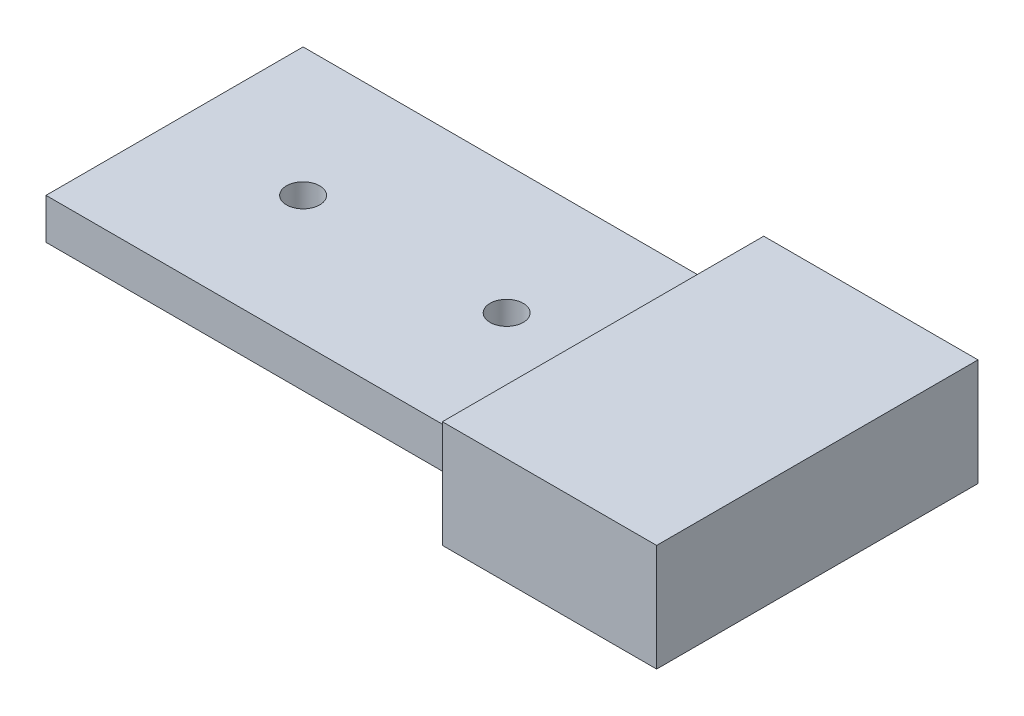
ISO-10303-21;
HEADER;
FILE_DESCRIPTION(('STEP AP214'),'2;1');
FILE_NAME('part.step','',(''),(''),'','','');
FILE_SCHEMA(('AUTOMOTIVE_DESIGN { 1 0 10303 214 1 1 1 1 }'));
ENDSEC;
DATA;
#1=APPLICATION_CONTEXT('core data for automotive mechanical design processes');
#2=APPLICATION_PROTOCOL_DEFINITION('international standard','automotive_design',2000,#1);
#3=PRODUCT_CONTEXT('',#1,'mechanical');
#4=PRODUCT('Part','Part','',(#3));
#5=PRODUCT_RELATED_PRODUCT_CATEGORY('part','',(#4));
#6=PRODUCT_DEFINITION_FORMATION('','',#4);
#7=PRODUCT_DEFINITION_CONTEXT('part definition',#1,'design');
#8=PRODUCT_DEFINITION('design','',#6,#7);
#9=PRODUCT_DEFINITION_SHAPE('','',#8);
#10=(LENGTH_UNIT() NAMED_UNIT(*) SI_UNIT(.MILLI.,.METRE.));
#11=(NAMED_UNIT(*) PLANE_ANGLE_UNIT() SI_UNIT($,.RADIAN.));
#12=(NAMED_UNIT(*) SI_UNIT($,.STERADIAN.) SOLID_ANGLE_UNIT());
#13=UNCERTAINTY_MEASURE_WITH_UNIT(LENGTH_MEASURE(1.E-05),#10,'distance_accuracy_value','');
#14=(GEOMETRIC_REPRESENTATION_CONTEXT(3) GLOBAL_UNCERTAINTY_ASSIGNED_CONTEXT((#13)) GLOBAL_UNIT_ASSIGNED_CONTEXT((#10,
#11,#12)) REPRESENTATION_CONTEXT('',''));
#15=CARTESIAN_POINT('',(0.,0.,0.));
#16=DIRECTION('',(0.,0.,1.));
#17=DIRECTION('',(1.,0.,0.));
#18=AXIS2_PLACEMENT_3D('',#15,#16,#17);
#19=CARTESIAN_POINT('',(40.,-1.9,12.));
#20=DIRECTION('',(0.,0.,-1.));
#21=DIRECTION('',(-1.,0.,0.));
#22=AXIS2_PLACEMENT_3D('',#19,#20,#21);
#23=PLANE('',#22);
#24=DIRECTION('',(0.,-1.,0.));
#25=VECTOR('',#24,1.);
#26=CARTESIAN_POINT('',(0.,-1.9,12.));
#27=LINE('',#26,#25);
#28=CARTESIAN_POINT('',(0.,1.9,12.));
#29=VERTEX_POINT('',#28);
#30=CARTESIAN_POINT('',(0.,-1.9,12.));
#31=VERTEX_POINT('',#30);
#32=EDGE_CURVE('E146',#29,#31,#27,.T.);
#33=ORIENTED_EDGE('',*,*,#32,.T.);
#34=DIRECTION('',(-1.,0.,0.));
#35=VECTOR('',#34,1.);
#36=CARTESIAN_POINT('',(40.,-1.9,12.));
#37=LINE('',#36,#35);
#38=CARTESIAN_POINT('',(40.,-1.9,12.));
#39=VERTEX_POINT('',#38);
#40=EDGE_CURVE('E11',#39,#31,#37,.T.);
#41=ORIENTED_EDGE('',*,*,#40,.F.);
#42=DIRECTION('',(0.,-1.,0.));
#43=VECTOR('',#42,1.);
#44=CARTESIAN_POINT('',(40.,-1.9,12.));
#45=LINE('',#44,#43);
#46=CARTESIAN_POINT('',(40.,1.9,12.));
#47=VERTEX_POINT('',#46);
#48=EDGE_CURVE('E152',#47,#39,#45,.T.);
#49=ORIENTED_EDGE('',*,*,#48,.F.);
#50=DIRECTION('',(-1.,0.,0.));
#51=VECTOR('',#50,1.);
#52=CARTESIAN_POINT('',(40.,1.9,12.));
#53=LINE('',#52,#51);
#54=EDGE_CURVE('E162',#47,#29,#53,.T.);
#55=ORIENTED_EDGE('',*,*,#54,.T.);
#56=EDGE_LOOP('',(#33,#41,#49,#55));
#57=FACE_BOUND('',#56,.T.);
#58=ADVANCED_FACE('F36',(#57),#23,.F.);
#59=CARTESIAN_POINT('',(40.,-1.9,-12.));
#60=DIRECTION('',(0.,1.,0.));
#61=DIRECTION('',(0.,0.,1.));
#62=AXIS2_PLACEMENT_3D('',#59,#60,#61);
#63=PLANE('',#62);
#64=CARTESIAN_POINT('',(12.,-1.9,0.));
#65=DIRECTION('',(0.,-1.,0.));
#66=DIRECTION('',(0.,0.,-1.));
#67=AXIS2_PLACEMENT_3D('',#64,#65,#66);
#68=CIRCLE('',#67,1.55);
#69=CARTESIAN_POINT('',(12.,-1.9,-1.55));
#70=VERTEX_POINT('',#69);
#71=EDGE_CURVE('E147',#70,#70,#68,.T.);
#72=ORIENTED_EDGE('',*,*,#71,.F.);
#73=EDGE_LOOP('',(#72));
#74=FACE_BOUND('',#73,.T.);
#75=CARTESIAN_POINT('',(31.,-1.9,0.));
#76=DIRECTION('',(0.,-1.,0.));
#77=DIRECTION('',(0.,0.,-1.));
#78=AXIS2_PLACEMENT_3D('',#75,#76,#77);
#79=CIRCLE('',#78,1.55);
#80=CARTESIAN_POINT('',(31.,-1.9,-1.55));
#81=VERTEX_POINT('',#80);
#82=EDGE_CURVE('E134',#81,#81,#79,.T.);
#83=ORIENTED_EDGE('',*,*,#82,.F.);
#84=EDGE_LOOP('',(#83));
#85=FACE_BOUND('',#84,.T.);
#86=DIRECTION('',(0.,0.,-1.));
#87=VECTOR('',#86,1.);
#88=CARTESIAN_POINT('',(0.,-1.9,-12.));
#89=LINE('',#88,#87);
#90=CARTESIAN_POINT('',(0.,-1.9,-12.));
#91=VERTEX_POINT('',#90);
#92=EDGE_CURVE('E165',#31,#91,#89,.T.);
#93=ORIENTED_EDGE('',*,*,#92,.T.);
#94=DIRECTION('',(-1.,0.,0.));
#95=VECTOR('',#94,1.);
#96=CARTESIAN_POINT('',(40.,-1.9,-12.));
#97=LINE('',#96,#95);
#98=CARTESIAN_POINT('',(40.,-1.9,-12.));
#99=VERTEX_POINT('',#98);
#100=EDGE_CURVE('E44',#99,#91,#97,.T.);
#101=ORIENTED_EDGE('',*,*,#100,.F.);
#102=DIRECTION('',(0.,0.,-1.));
#103=VECTOR('',#102,1.);
#104=CARTESIAN_POINT('',(40.,-1.9,-12.));
#105=LINE('',#104,#103);
#106=EDGE_CURVE('E78',#39,#99,#105,.T.);
#107=ORIENTED_EDGE('',*,*,#106,.F.);
#108=ORIENTED_EDGE('',*,*,#40,.T.);
#109=EDGE_LOOP('',(#93,#101,#107,#108));
#110=FACE_BOUND('',#109,.T.);
#111=ADVANCED_FACE('F193',(#74,#85,#110),#63,.F.);
#112=CARTESIAN_POINT('',(40.,-1.9,-12.));
#113=DIRECTION('',(0.,0.,1.));
#114=DIRECTION('',(1.,0.,0.));
#115=AXIS2_PLACEMENT_3D('',#112,#113,#114);
#116=PLANE('',#115);
#117=DIRECTION('',(0.,1.,0.));
#118=VECTOR('',#117,1.);
#119=CARTESIAN_POINT('',(0.,-1.9,-12.));
#120=LINE('',#119,#118);
#121=CARTESIAN_POINT('',(0.,1.9,-12.));
#122=VERTEX_POINT('',#121);
#123=EDGE_CURVE('E68',#91,#122,#120,.T.);
#124=ORIENTED_EDGE('',*,*,#123,.T.);
#125=DIRECTION('',(-1.,0.,0.));
#126=VECTOR('',#125,1.);
#127=CARTESIAN_POINT('',(40.,1.9,-12.));
#128=LINE('',#127,#126);
#129=CARTESIAN_POINT('',(40.,1.9,-12.));
#130=VERTEX_POINT('',#129);
#131=EDGE_CURVE('E52',#130,#122,#128,.T.);
#132=ORIENTED_EDGE('',*,*,#131,.F.);
#133=DIRECTION('',(0.,1.,0.));
#134=VECTOR('',#133,1.);
#135=CARTESIAN_POINT('',(40.,-1.9,-12.));
#136=LINE('',#135,#134);
#137=EDGE_CURVE('E156',#99,#130,#136,.T.);
#138=ORIENTED_EDGE('',*,*,#137,.F.);
#139=ORIENTED_EDGE('',*,*,#100,.T.);
#140=EDGE_LOOP('',(#124,#132,#138,#139));
#141=FACE_BOUND('',#140,.T.);
#142=ADVANCED_FACE('F170',(#141),#116,.F.);
#143=CARTESIAN_POINT('',(40.,1.9,-12.));
#144=DIRECTION('',(0.,-1.,0.));
#145=DIRECTION('',(0.,0.,-1.));
#146=AXIS2_PLACEMENT_3D('',#143,#144,#145);
#147=PLANE('',#146);
#148=CARTESIAN_POINT('',(12.,1.9,0.));
#149=DIRECTION('',(0.,-1.,0.));
#150=DIRECTION('',(0.,0.,-1.));
#151=AXIS2_PLACEMENT_3D('',#148,#149,#150);
#152=CIRCLE('',#151,1.55);
#153=CARTESIAN_POINT('',(12.,1.9,-1.55));
#154=VERTEX_POINT('',#153);
#155=EDGE_CURVE('E143',#154,#154,#152,.T.);
#156=ORIENTED_EDGE('',*,*,#155,.T.);
#157=EDGE_LOOP('',(#156));
#158=FACE_BOUND('',#157,.T.);
#159=CARTESIAN_POINT('',(31.,1.9,0.));
#160=DIRECTION('',(0.,-1.,0.));
#161=DIRECTION('',(0.,0.,-1.));
#162=AXIS2_PLACEMENT_3D('',#159,#160,#161);
#163=CIRCLE('',#162,1.55);
#164=CARTESIAN_POINT('',(31.,1.9,-1.55));
#165=VERTEX_POINT('',#164);
#166=EDGE_CURVE('E137',#165,#165,#163,.T.);
#167=ORIENTED_EDGE('',*,*,#166,.T.);
#168=EDGE_LOOP('',(#167));
#169=FACE_BOUND('',#168,.T.);
#170=DIRECTION('',(0.,0.,1.));
#171=VECTOR('',#170,1.);
#172=CARTESIAN_POINT('',(0.,1.9,-12.));
#173=LINE('',#172,#171);
#174=EDGE_CURVE('E73',#122,#29,#173,.T.);
#175=ORIENTED_EDGE('',*,*,#174,.T.);
#176=ORIENTED_EDGE('',*,*,#54,.F.);
#177=DIRECTION('',(0.,0.,1.));
#178=VECTOR('',#177,1.);
#179=CARTESIAN_POINT('',(40.,1.9,-12.));
#180=LINE('',#179,#178);
#181=EDGE_CURVE('E159',#130,#47,#180,.T.);
#182=ORIENTED_EDGE('',*,*,#181,.F.);
#183=ORIENTED_EDGE('',*,*,#131,.T.);
#184=EDGE_LOOP('',(#175,#176,#182,#183));
#185=FACE_BOUND('',#184,.T.);
#186=ADVANCED_FACE('F175',(#158,#169,#185),#147,.F.);
#187=CARTESIAN_POINT('',(0.,0.,0.));
#188=DIRECTION('',(1.,0.,0.));
#189=DIRECTION('',(0.,0.,-1.));
#190=AXIS2_PLACEMENT_3D('',#187,#188,#189);
#191=PLANE('',#190);
#192=ORIENTED_EDGE('',*,*,#32,.F.);
#193=ORIENTED_EDGE('',*,*,#174,.F.);
#194=ORIENTED_EDGE('',*,*,#123,.F.);
#195=ORIENTED_EDGE('',*,*,#92,.F.);
#196=EDGE_LOOP('',(#192,#193,#194,#195));
#197=FACE_BOUND('',#196,.T.);
#198=ADVANCED_FACE('F173',(#197),#191,.F.);
#199=CARTESIAN_POINT('',(31.,1.9,0.));
#200=DIRECTION('',(0.,-1.,0.));
#201=DIRECTION('',(0.,0.,-1.));
#202=AXIS2_PLACEMENT_3D('',#199,#200,#201);
#203=CYLINDRICAL_SURFACE('',#202,1.55);
#204=ORIENTED_EDGE('',*,*,#166,.F.);
#205=EDGE_LOOP('',(#204));
#206=FACE_BOUND('',#205,.T.);
#207=ORIENTED_EDGE('',*,*,#82,.T.);
#208=EDGE_LOOP('',(#207));
#209=FACE_BOUND('',#208,.T.);
#210=ADVANCED_FACE('F187',(#206,#209),#203,.F.);
#211=CARTESIAN_POINT('',(12.,1.9,0.));
#212=DIRECTION('',(0.,-1.,0.));
#213=DIRECTION('',(0.,0.,-1.));
#214=AXIS2_PLACEMENT_3D('',#211,#212,#213);
#215=CYLINDRICAL_SURFACE('',#214,1.55);
#216=ORIENTED_EDGE('',*,*,#155,.F.);
#217=EDGE_LOOP('',(#216));
#218=FACE_BOUND('',#217,.T.);
#219=ORIENTED_EDGE('',*,*,#71,.T.);
#220=EDGE_LOOP('',(#219));
#221=FACE_BOUND('',#220,.T.);
#222=ADVANCED_FACE('F179',(#218,#221),#215,.F.);
#223=CARTESIAN_POINT('',(40.,0.,0.));
#224=DIRECTION('',(1.,0.,0.));
#225=DIRECTION('',(0.,0.,-1.));
#226=AXIS2_PLACEMENT_3D('',#223,#224,#225);
#227=PLANE('',#226);
#228=DIRECTION('',(0.,-1.,0.));
#229=VECTOR('',#228,1.);
#230=CARTESIAN_POINT('',(40.,-4.9,15.));
#231=LINE('',#230,#229);
#232=CARTESIAN_POINT('',(40.,5.1,15.));
#233=VERTEX_POINT('',#232);
#234=CARTESIAN_POINT('',(40.,-4.9,15.));
#235=VERTEX_POINT('',#234);
#236=EDGE_CURVE('E133',#233,#235,#231,.T.);
#237=ORIENTED_EDGE('',*,*,#236,.F.);
#238=DIRECTION('',(0.,0.,1.));
#239=VECTOR('',#238,1.);
#240=CARTESIAN_POINT('',(40.,5.1,-15.));
#241=LINE('',#240,#239);
#242=CARTESIAN_POINT('',(40.,5.1,-15.));
#243=VERTEX_POINT('',#242);
#244=EDGE_CURVE('E129',#243,#233,#241,.T.);
#245=ORIENTED_EDGE('',*,*,#244,.F.);
#246=DIRECTION('',(0.,1.,0.));
#247=VECTOR('',#246,1.);
#248=CARTESIAN_POINT('',(40.,-4.9,-15.));
#249=LINE('',#248,#247);
#250=CARTESIAN_POINT('',(40.,-4.9,-15.));
#251=VERTEX_POINT('',#250);
#252=EDGE_CURVE('E230',#251,#243,#249,.T.);
#253=ORIENTED_EDGE('',*,*,#252,.F.);
#254=DIRECTION('',(0.,0.,-1.));
#255=VECTOR('',#254,1.);
#256=CARTESIAN_POINT('',(40.,-4.9,-15.));
#257=LINE('',#256,#255);
#258=EDGE_CURVE('E233',#235,#251,#257,.T.);
#259=ORIENTED_EDGE('',*,*,#258,.F.);
#260=EDGE_LOOP('',(#237,#245,#253,#259));
#261=FACE_BOUND('',#260,.T.);
#262=ORIENTED_EDGE('',*,*,#181,.T.);
#263=ORIENTED_EDGE('',*,*,#48,.T.);
#264=ORIENTED_EDGE('',*,*,#106,.T.);
#265=ORIENTED_EDGE('',*,*,#137,.T.);
#266=EDGE_LOOP('',(#262,#263,#264,#265));
#267=FACE_BOUND('',#266,.T.);
#268=ADVANCED_FACE('F177',(#261,#267),#227,.F.);
#269=CARTESIAN_POINT('',(60.,-4.9,15.));
#270=DIRECTION('',(0.,0.,-1.));
#271=DIRECTION('',(-1.,0.,0.));
#272=AXIS2_PLACEMENT_3D('',#269,#270,#271);
#273=PLANE('',#272);
#274=ORIENTED_EDGE('',*,*,#236,.T.);
#275=DIRECTION('',(-1.,0.,0.));
#276=VECTOR('',#275,1.);
#277=CARTESIAN_POINT('',(60.,-4.9,15.));
#278=LINE('',#277,#276);
#279=CARTESIAN_POINT('',(60.,-4.9,15.));
#280=VERTEX_POINT('',#279);
#281=EDGE_CURVE('E113',#280,#235,#278,.T.);
#282=ORIENTED_EDGE('',*,*,#281,.F.);
#283=DIRECTION('',(0.,-1.,0.));
#284=VECTOR('',#283,1.);
#285=CARTESIAN_POINT('',(60.,-4.9,15.));
#286=LINE('',#285,#284);
#287=CARTESIAN_POINT('',(60.,5.1,15.));
#288=VERTEX_POINT('',#287);
#289=EDGE_CURVE('E120',#288,#280,#286,.T.);
#290=ORIENTED_EDGE('',*,*,#289,.F.);
#291=DIRECTION('',(-1.,0.,0.));
#292=VECTOR('',#291,1.);
#293=CARTESIAN_POINT('',(60.,5.1,15.));
#294=LINE('',#293,#292);
#295=EDGE_CURVE('E227',#288,#233,#294,.T.);
#296=ORIENTED_EDGE('',*,*,#295,.T.);
#297=EDGE_LOOP('',(#274,#282,#290,#296));
#298=FACE_BOUND('',#297,.T.);
#299=ADVANCED_FACE('F131',(#298),#273,.F.);
#300=CARTESIAN_POINT('',(60.,-4.9,-15.));
#301=DIRECTION('',(0.,1.,0.));
#302=DIRECTION('',(0.,0.,1.));
#303=AXIS2_PLACEMENT_3D('',#300,#301,#302);
#304=PLANE('',#303);
#305=ORIENTED_EDGE('',*,*,#258,.T.);
#306=DIRECTION('',(-1.,0.,0.));
#307=VECTOR('',#306,1.);
#308=CARTESIAN_POINT('',(60.,-4.9,-15.));
#309=LINE('',#308,#307);
#310=CARTESIAN_POINT('',(60.,-4.9,-15.));
#311=VERTEX_POINT('',#310);
#312=EDGE_CURVE('E116',#311,#251,#309,.T.);
#313=ORIENTED_EDGE('',*,*,#312,.F.);
#314=DIRECTION('',(0.,0.,-1.));
#315=VECTOR('',#314,1.);
#316=CARTESIAN_POINT('',(60.,-4.9,-15.));
#317=LINE('',#316,#315);
#318=EDGE_CURVE('E109',#280,#311,#317,.T.);
#319=ORIENTED_EDGE('',*,*,#318,.F.);
#320=ORIENTED_EDGE('',*,*,#281,.T.);
#321=EDGE_LOOP('',(#305,#313,#319,#320));
#322=FACE_BOUND('',#321,.T.);
#323=ADVANCED_FACE('F111',(#322),#304,.F.);
#324=CARTESIAN_POINT('',(60.,-4.9,-15.));
#325=DIRECTION('',(0.,0.,1.));
#326=DIRECTION('',(1.,0.,0.));
#327=AXIS2_PLACEMENT_3D('',#324,#325,#326);
#328=PLANE('',#327);
#329=ORIENTED_EDGE('',*,*,#252,.T.);
#330=DIRECTION('',(-1.,0.,0.));
#331=VECTOR('',#330,1.);
#332=CARTESIAN_POINT('',(60.,5.1,-15.));
#333=LINE('',#332,#331);
#334=CARTESIAN_POINT('',(60.,5.1,-15.));
#335=VERTEX_POINT('',#334);
#336=EDGE_CURVE('E139',#335,#243,#333,.T.);
#337=ORIENTED_EDGE('',*,*,#336,.F.);
#338=DIRECTION('',(0.,1.,0.));
#339=VECTOR('',#338,1.);
#340=CARTESIAN_POINT('',(60.,-4.9,-15.));
#341=LINE('',#340,#339);
#342=EDGE_CURVE('E119',#311,#335,#341,.T.);
#343=ORIENTED_EDGE('',*,*,#342,.F.);
#344=ORIENTED_EDGE('',*,*,#312,.T.);
#345=EDGE_LOOP('',(#329,#337,#343,#344));
#346=FACE_BOUND('',#345,.T.);
#347=ADVANCED_FACE('F216',(#346),#328,.F.);
#348=CARTESIAN_POINT('',(60.,5.1,-15.));
#349=DIRECTION('',(0.,-1.,0.));
#350=DIRECTION('',(0.,0.,-1.));
#351=AXIS2_PLACEMENT_3D('',#348,#349,#350);
#352=PLANE('',#351);
#353=ORIENTED_EDGE('',*,*,#244,.T.);
#354=ORIENTED_EDGE('',*,*,#295,.F.);
#355=DIRECTION('',(0.,0.,1.));
#356=VECTOR('',#355,1.);
#357=CARTESIAN_POINT('',(60.,5.1,-15.));
#358=LINE('',#357,#356);
#359=EDGE_CURVE('E125',#335,#288,#358,.T.);
#360=ORIENTED_EDGE('',*,*,#359,.F.);
#361=ORIENTED_EDGE('',*,*,#336,.T.);
#362=EDGE_LOOP('',(#353,#354,#360,#361));
#363=FACE_BOUND('',#362,.T.);
#364=ADVANCED_FACE('F218',(#363),#352,.F.);
#365=CARTESIAN_POINT('',(60.,0.,0.));
#366=DIRECTION('',(1.,0.,0.));
#367=DIRECTION('',(0.,0.,-1.));
#368=AXIS2_PLACEMENT_3D('',#365,#366,#367);
#369=PLANE('',#368);
#370=ORIENTED_EDGE('',*,*,#289,.T.);
#371=ORIENTED_EDGE('',*,*,#318,.T.);
#372=ORIENTED_EDGE('',*,*,#342,.T.);
#373=ORIENTED_EDGE('',*,*,#359,.T.);
#374=EDGE_LOOP('',(#370,#371,#372,#373));
#375=FACE_BOUND('',#374,.T.);
#376=ADVANCED_FACE('F123',(#375),#369,.T.);
#377=CLOSED_SHELL('',(#58,#111,#142,#186,#198,#210,#222,#268,#299,#323,#347,#364,#376));
#378=MANIFOLD_SOLID_BREP('B2',#377);
#379=ADVANCED_BREP_SHAPE_REPRESENTATION('',(#18,#378),#14);
#380=SHAPE_DEFINITION_REPRESENTATION(#9,#379);
ENDSEC;
END-ISO-10303-21;
